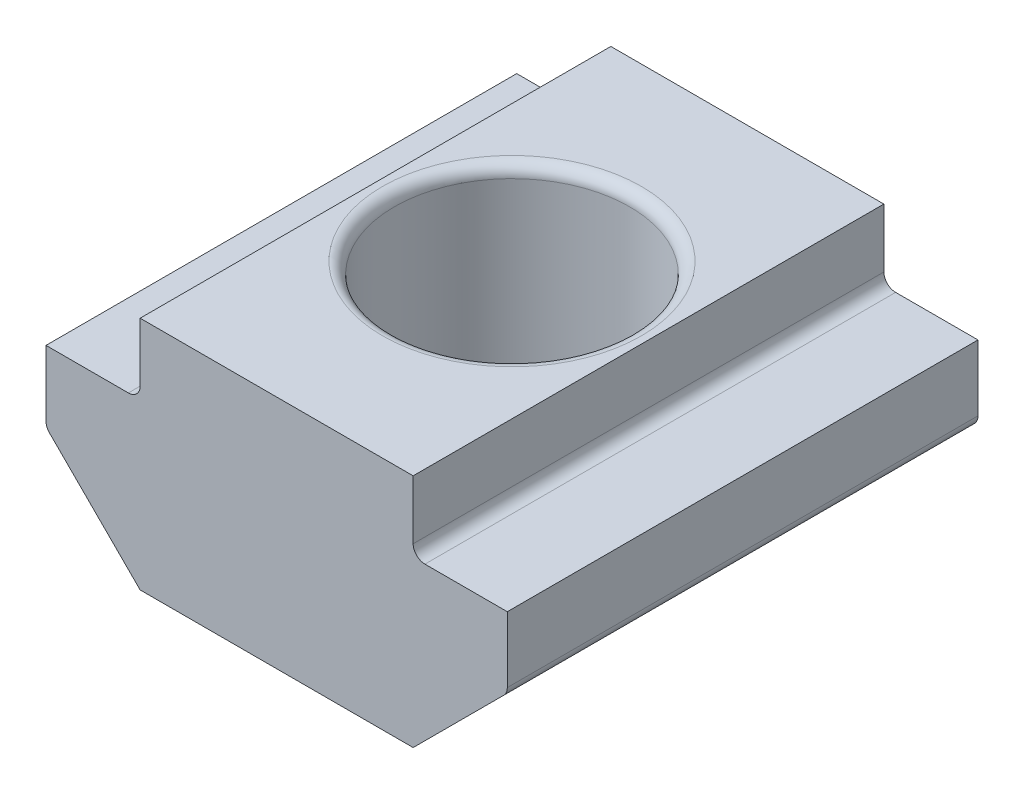
ISO-10303-21;
HEADER;
FILE_DESCRIPTION(('STEP AP214'),'2;1');
FILE_NAME('part.step','',(''),(''),'','','');
FILE_SCHEMA(('AUTOMOTIVE_DESIGN { 1 0 10303 214 1 1 1 1 }'));
ENDSEC;
DATA;
#1=APPLICATION_CONTEXT('core data for automotive mechanical design processes');
#2=APPLICATION_PROTOCOL_DEFINITION('international standard','automotive_design',2000,#1);
#3=PRODUCT_CONTEXT('',#1,'mechanical');
#4=PRODUCT('Part','Part','',(#3));
#5=PRODUCT_RELATED_PRODUCT_CATEGORY('part','',(#4));
#6=PRODUCT_DEFINITION_FORMATION('','',#4);
#7=PRODUCT_DEFINITION_CONTEXT('part definition',#1,'design');
#8=PRODUCT_DEFINITION('design','',#6,#7);
#9=PRODUCT_DEFINITION_SHAPE('','',#8);
#10=(LENGTH_UNIT() NAMED_UNIT(*) SI_UNIT(.MILLI.,.METRE.));
#11=(NAMED_UNIT(*) PLANE_ANGLE_UNIT() SI_UNIT($,.RADIAN.));
#12=(NAMED_UNIT(*) SI_UNIT($,.STERADIAN.) SOLID_ANGLE_UNIT());
#13=UNCERTAINTY_MEASURE_WITH_UNIT(LENGTH_MEASURE(1.E-05),#10,'distance_accuracy_value','');
#14=(GEOMETRIC_REPRESENTATION_CONTEXT(3) GLOBAL_UNCERTAINTY_ASSIGNED_CONTEXT((#13)) GLOBAL_UNIT_ASSIGNED_CONTEXT((#10,
#11,#12)) REPRESENTATION_CONTEXT('',''));
#15=CARTESIAN_POINT('',(0.,0.,0.));
#16=DIRECTION('',(0.,0.,1.));
#17=DIRECTION('',(1.,0.,0.));
#18=AXIS2_PLACEMENT_3D('',#15,#16,#17);
#19=CARTESIAN_POINT('',(2.9,-0.75,5.));
#20=DIRECTION('',(-1.,0.,0.));
#21=DIRECTION('',(0.,-1.,0.));
#22=AXIS2_PLACEMENT_3D('',#19,#20,#21);
#23=PLANE('',#22);
#24=DIRECTION('',(0.,1.,0.));
#25=VECTOR('',#24,1.);
#26=CARTESIAN_POINT('',(2.9,-0.75,5.));
#27=LINE('',#26,#25);
#28=CARTESIAN_POINT('',(2.9,-0.5,5.));
#29=VERTEX_POINT('',#28);
#30=CARTESIAN_POINT('',(2.9,0.75,5.));
#31=VERTEX_POINT('',#30);
#32=EDGE_CURVE('E138',#29,#31,#27,.T.);
#33=ORIENTED_EDGE('',*,*,#32,.F.);
#34=DIRECTION('',(0.,0.,-1.));
#35=VECTOR('',#34,1.);
#36=CARTESIAN_POINT('',(2.9,-0.5,-5.));
#37=LINE('',#36,#35);
#38=CARTESIAN_POINT('',(2.9,-0.5,-5.));
#39=VERTEX_POINT('',#38);
#40=EDGE_CURVE('E192',#29,#39,#37,.T.);
#41=ORIENTED_EDGE('',*,*,#40,.T.);
#42=DIRECTION('',(0.,1.,0.));
#43=VECTOR('',#42,1.);
#44=CARTESIAN_POINT('',(2.9,-0.75,-5.));
#45=LINE('',#44,#43);
#46=CARTESIAN_POINT('',(2.9,0.75,-5.));
#47=VERTEX_POINT('',#46);
#48=EDGE_CURVE('E163',#39,#47,#45,.T.);
#49=ORIENTED_EDGE('',*,*,#48,.T.);
#50=DIRECTION('',(0.,0.,-1.));
#51=VECTOR('',#50,1.);
#52=CARTESIAN_POINT('',(2.9,0.75,5.));
#53=LINE('',#52,#51);
#54=EDGE_CURVE('E156',#31,#47,#53,.T.);
#55=ORIENTED_EDGE('',*,*,#54,.F.);
#56=EDGE_LOOP('',(#33,#41,#49,#55));
#57=FACE_BOUND('',#56,.T.);
#58=ADVANCED_FACE('F36',(#57),#23,.F.);
#59=CARTESIAN_POINT('',(-2.9,0.75,5.));
#60=DIRECTION('',(0.,-1.,0.));
#61=DIRECTION('',(1.,0.,0.));
#62=AXIS2_PLACEMENT_3D('',#59,#60,#61);
#63=PLANE('',#62);
#64=CARTESIAN_POINT('',(0.,0.75,0.));
#65=DIRECTION('',(0.,-1.,0.));
#66=DIRECTION('',(1.,0.,0.));
#67=AXIS2_PLACEMENT_3D('',#64,#65,#66);
#68=CIRCLE('',#67,2.75);
#69=CARTESIAN_POINT('',(2.75,0.75,0.));
#70=VERTEX_POINT('',#69);
#71=EDGE_CURVE('E11',#70,#70,#68,.T.);
#72=ORIENTED_EDGE('',*,*,#71,.T.);
#73=EDGE_LOOP('',(#72));
#74=FACE_BOUND('',#73,.T.);
#75=DIRECTION('',(-1.,0.,0.));
#76=VECTOR('',#75,1.);
#77=CARTESIAN_POINT('',(-2.9,0.75,-5.));
#78=LINE('',#77,#76);
#79=CARTESIAN_POINT('',(-2.9,0.75,-5.));
#80=VERTEX_POINT('',#79);
#81=EDGE_CURVE('E278',#47,#80,#78,.T.);
#82=ORIENTED_EDGE('',*,*,#81,.T.);
#83=DIRECTION('',(0.,0.,-1.));
#84=VECTOR('',#83,1.);
#85=CARTESIAN_POINT('',(-2.9,0.75,5.));
#86=LINE('',#85,#84);
#87=CARTESIAN_POINT('',(-2.9,0.75,5.));
#88=VERTEX_POINT('',#87);
#89=EDGE_CURVE('E158',#88,#80,#86,.T.);
#90=ORIENTED_EDGE('',*,*,#89,.F.);
#91=DIRECTION('',(-1.,0.,0.));
#92=VECTOR('',#91,1.);
#93=CARTESIAN_POINT('',(-2.9,0.75,5.));
#94=LINE('',#93,#92);
#95=EDGE_CURVE('E143',#31,#88,#94,.T.);
#96=ORIENTED_EDGE('',*,*,#95,.F.);
#97=ORIENTED_EDGE('',*,*,#54,.T.);
#98=EDGE_LOOP('',(#82,#90,#96,#97));
#99=FACE_BOUND('',#98,.T.);
#100=ADVANCED_FACE('F155',(#74,#99),#63,.F.);
#101=CARTESIAN_POINT('',(-2.9,-0.750000000000001,5.));
#102=DIRECTION('',(1.,0.,0.));
#103=DIRECTION('',(0.,0.,-1.));
#104=AXIS2_PLACEMENT_3D('',#101,#102,#103);
#105=PLANE('',#104);
#106=DIRECTION('',(0.,-1.,0.));
#107=VECTOR('',#106,1.);
#108=CARTESIAN_POINT('',(-2.9,-0.750000000000001,-5.));
#109=LINE('',#108,#107);
#110=CARTESIAN_POINT('',(-2.9,-0.500000000000001,-5.));
#111=VERTEX_POINT('',#110);
#112=EDGE_CURVE('E273',#80,#111,#109,.T.);
#113=ORIENTED_EDGE('',*,*,#112,.T.);
#114=DIRECTION('',(0.,0.,-1.));
#115=VECTOR('',#114,1.);
#116=CARTESIAN_POINT('',(-2.9,-0.500000000000001,5.));
#117=LINE('',#116,#115);
#118=CARTESIAN_POINT('',(-2.9,-0.500000000000001,5.));
#119=VERTEX_POINT('',#118);
#120=EDGE_CURVE('E190',#111,#119,#117,.F.);
#121=ORIENTED_EDGE('',*,*,#120,.T.);
#122=DIRECTION('',(0.,-1.,0.));
#123=VECTOR('',#122,1.);
#124=CARTESIAN_POINT('',(-2.9,-0.750000000000001,5.));
#125=LINE('',#124,#123);
#126=EDGE_CURVE('E160',#88,#119,#125,.T.);
#127=ORIENTED_EDGE('',*,*,#126,.F.);
#128=ORIENTED_EDGE('',*,*,#89,.T.);
#129=EDGE_LOOP('',(#113,#121,#127,#128));
#130=FACE_BOUND('',#129,.T.);
#131=ADVANCED_FACE('F315',(#130),#105,.F.);
#132=CARTESIAN_POINT('',(-2.9,-0.750000000000001,5.));
#133=DIRECTION('',(0.,-1.,0.));
#134=DIRECTION('',(1.,0.,0.));
#135=AXIS2_PLACEMENT_3D('',#132,#133,#134);
#136=PLANE('',#135);
#137=DIRECTION('',(-1.,0.,0.));
#138=VECTOR('',#137,1.);
#139=CARTESIAN_POINT('',(-2.9,-0.750000000000001,5.));
#140=LINE('',#139,#138);
#141=CARTESIAN_POINT('',(-3.15,-0.750000000000001,5.));
#142=VERTEX_POINT('',#141);
#143=CARTESIAN_POINT('',(-4.9,-0.750000000000001,5.));
#144=VERTEX_POINT('',#143);
#145=EDGE_CURVE('E290',#142,#144,#140,.T.);
#146=ORIENTED_EDGE('',*,*,#145,.F.);
#147=DIRECTION('',(0.,0.,-1.));
#148=VECTOR('',#147,1.);
#149=CARTESIAN_POINT('',(-3.15,-0.750000000000001,-5.));
#150=LINE('',#149,#148);
#151=CARTESIAN_POINT('',(-3.15,-0.750000000000001,-5.));
#152=VERTEX_POINT('',#151);
#153=EDGE_CURVE('E187',#142,#152,#150,.T.);
#154=ORIENTED_EDGE('',*,*,#153,.T.);
#155=DIRECTION('',(-1.,0.,0.));
#156=VECTOR('',#155,1.);
#157=CARTESIAN_POINT('',(-2.9,-0.750000000000001,-5.));
#158=LINE('',#157,#156);
#159=CARTESIAN_POINT('',(-4.9,-0.750000000000001,-5.));
#160=VERTEX_POINT('',#159);
#161=EDGE_CURVE('E271',#152,#160,#158,.T.);
#162=ORIENTED_EDGE('',*,*,#161,.T.);
#163=DIRECTION('',(0.,0.,-1.));
#164=VECTOR('',#163,1.);
#165=CARTESIAN_POINT('',(-4.9,-0.750000000000001,5.));
#166=LINE('',#165,#164);
#167=EDGE_CURVE('E170',#144,#160,#166,.T.);
#168=ORIENTED_EDGE('',*,*,#167,.F.);
#169=EDGE_LOOP('',(#146,#154,#162,#168));
#170=FACE_BOUND('',#169,.T.);
#171=ADVANCED_FACE('F298',(#170),#136,.F.);
#172=CARTESIAN_POINT('',(-4.9,-0.750000000000001,5.));
#173=DIRECTION('',(1.,0.,0.));
#174=DIRECTION('',(0.,0.,-1.));
#175=AXIS2_PLACEMENT_3D('',#172,#173,#174);
#176=PLANE('',#175);
#177=DIRECTION('',(0.,-1.,0.));
#178=VECTOR('',#177,1.);
#179=CARTESIAN_POINT('',(-4.9,-0.750000000000001,-5.));
#180=LINE('',#179,#178);
#181=CARTESIAN_POINT('',(-4.9,-2.14644660940673,-5.));
#182=VERTEX_POINT('',#181);
#183=EDGE_CURVE('E265',#160,#182,#180,.T.);
#184=ORIENTED_EDGE('',*,*,#183,.T.);
#185=DIRECTION('',(0.,0.,-1.));
#186=VECTOR('',#185,1.);
#187=CARTESIAN_POINT('',(-4.9,-2.14644660940673,5.));
#188=LINE('',#187,#186);
#189=CARTESIAN_POINT('',(-4.9,-2.14644660940673,5.));
#190=VERTEX_POINT('',#189);
#191=EDGE_CURVE('E185',#182,#190,#188,.F.);
#192=ORIENTED_EDGE('',*,*,#191,.T.);
#193=DIRECTION('',(0.,-1.,0.));
#194=VECTOR('',#193,1.);
#195=CARTESIAN_POINT('',(-4.9,-0.750000000000001,5.));
#196=LINE('',#195,#194);
#197=EDGE_CURVE('E267',#144,#190,#196,.T.);
#198=ORIENTED_EDGE('',*,*,#197,.F.);
#199=ORIENTED_EDGE('',*,*,#167,.T.);
#200=EDGE_LOOP('',(#184,#192,#198,#199));
#201=FACE_BOUND('',#200,.T.);
#202=ADVANCED_FACE('F264',(#201),#176,.F.);
#203=CARTESIAN_POINT('',(-4.9,-2.25,5.));
#204=DIRECTION('',(0.707106781186545,0.70710678118655,0.));
#205=DIRECTION('',(-0.70710678118655,0.707106781186545,0.));
#206=AXIS2_PLACEMENT_3D('',#203,#204,#205);
#207=PLANE('',#206);
#208=DIRECTION('',(0.70710678118655,-0.707106781186545,0.));
#209=VECTOR('',#208,1.);
#210=CARTESIAN_POINT('',(-4.9,-2.25,5.));
#211=LINE('',#210,#209);
#212=CARTESIAN_POINT('',(-4.82677669529664,-2.32322330470336,5.));
#213=VERTEX_POINT('',#212);
#214=CARTESIAN_POINT('',(-2.89999999999999,-4.25,5.));
#215=VERTEX_POINT('',#214);
#216=EDGE_CURVE('E287',#213,#215,#211,.T.);
#217=ORIENTED_EDGE('',*,*,#216,.F.);
#218=DIRECTION('',(0.,0.,-1.));
#219=VECTOR('',#218,1.);
#220=CARTESIAN_POINT('',(-4.82677669529664,-2.32322330470336,5.));
#221=LINE('',#220,#219);
#222=CARTESIAN_POINT('',(-4.82677669529664,-2.32322330470336,-5.));
#223=VERTEX_POINT('',#222);
#224=EDGE_CURVE('E182',#213,#223,#221,.T.);
#225=ORIENTED_EDGE('',*,*,#224,.T.);
#226=DIRECTION('',(0.70710678118655,-0.707106781186545,0.));
#227=VECTOR('',#226,1.);
#228=CARTESIAN_POINT('',(-4.9,-2.25,-5.));
#229=LINE('',#228,#227);
#230=CARTESIAN_POINT('',(-2.89999999999999,-4.25,-5.));
#231=VERTEX_POINT('',#230);
#232=EDGE_CURVE('E239',#223,#231,#229,.T.);
#233=ORIENTED_EDGE('',*,*,#232,.T.);
#234=DIRECTION('',(0.,0.,-1.));
#235=VECTOR('',#234,1.);
#236=CARTESIAN_POINT('',(-2.89999999999999,-4.25,5.));
#237=LINE('',#236,#235);
#238=EDGE_CURVE('E234',#215,#231,#237,.T.);
#239=ORIENTED_EDGE('',*,*,#238,.F.);
#240=EDGE_LOOP('',(#217,#225,#233,#239));
#241=FACE_BOUND('',#240,.T.);
#242=ADVANCED_FACE('F223',(#241),#207,.F.);
#243=CARTESIAN_POINT('',(-2.89999999999999,-4.25,5.));
#244=DIRECTION('',(0.,1.,0.));
#245=DIRECTION('',(-1.,0.,0.));
#246=AXIS2_PLACEMENT_3D('',#243,#244,#245);
#247=PLANE('',#246);
#248=CARTESIAN_POINT('',(0.,-4.25,0.));
#249=DIRECTION('',(0.,1.,0.));
#250=DIRECTION('',(-1.,0.,0.));
#251=AXIS2_PLACEMENT_3D('',#248,#249,#250);
#252=CIRCLE('',#251,2.75);
#253=CARTESIAN_POINT('',(-2.75,-4.25,0.));
#254=VERTEX_POINT('',#253);
#255=EDGE_CURVE('E202',#254,#254,#252,.T.);
#256=ORIENTED_EDGE('',*,*,#255,.T.);
#257=EDGE_LOOP('',(#256));
#258=FACE_BOUND('',#257,.T.);
#259=DIRECTION('',(1.,0.,0.));
#260=VECTOR('',#259,1.);
#261=CARTESIAN_POINT('',(-2.89999999999999,-4.25,-5.));
#262=LINE('',#261,#260);
#263=CARTESIAN_POINT('',(2.89999999999999,-4.25,-5.));
#264=VERTEX_POINT('',#263);
#265=EDGE_CURVE('E228',#231,#264,#262,.T.);
#266=ORIENTED_EDGE('',*,*,#265,.T.);
#267=DIRECTION('',(0.,0.,-1.));
#268=VECTOR('',#267,1.);
#269=CARTESIAN_POINT('',(2.89999999999999,-4.25,5.));
#270=LINE('',#269,#268);
#271=CARTESIAN_POINT('',(2.89999999999999,-4.25,5.));
#272=VERTEX_POINT('',#271);
#273=EDGE_CURVE('E231',#272,#264,#270,.T.);
#274=ORIENTED_EDGE('',*,*,#273,.F.);
#275=DIRECTION('',(1.,0.,0.));
#276=VECTOR('',#275,1.);
#277=CARTESIAN_POINT('',(-2.89999999999999,-4.25,5.));
#278=LINE('',#277,#276);
#279=EDGE_CURVE('E285',#215,#272,#278,.T.);
#280=ORIENTED_EDGE('',*,*,#279,.F.);
#281=ORIENTED_EDGE('',*,*,#238,.T.);
#282=EDGE_LOOP('',(#266,#274,#280,#281));
#283=FACE_BOUND('',#282,.T.);
#284=ADVANCED_FACE('F219',(#258,#283),#247,.F.);
#285=CARTESIAN_POINT('',(4.9,-2.25,5.));
#286=DIRECTION('',(-0.707106781186545,0.70710678118655,0.));
#287=DIRECTION('',(-0.70710678118655,-0.707106781186545,0.));
#288=AXIS2_PLACEMENT_3D('',#285,#286,#287);
#289=PLANE('',#288);
#290=DIRECTION('',(0.70710678118655,0.707106781186545,0.));
#291=VECTOR('',#290,1.);
#292=CARTESIAN_POINT('',(4.9,-2.25,-5.));
#293=LINE('',#292,#291);
#294=CARTESIAN_POINT('',(4.82677669529664,-2.32322330470336,-5.));
#295=VERTEX_POINT('',#294);
#296=EDGE_CURVE('E238',#264,#295,#293,.T.);
#297=ORIENTED_EDGE('',*,*,#296,.T.);
#298=DIRECTION('',(0.,0.,-1.));
#299=VECTOR('',#298,1.);
#300=CARTESIAN_POINT('',(4.82677669529664,-2.32322330470336,5.));
#301=LINE('',#300,#299);
#302=CARTESIAN_POINT('',(4.82677669529664,-2.32322330470336,5.));
#303=VERTEX_POINT('',#302);
#304=EDGE_CURVE('E177',#295,#303,#301,.F.);
#305=ORIENTED_EDGE('',*,*,#304,.T.);
#306=DIRECTION('',(0.70710678118655,0.707106781186545,0.));
#307=VECTOR('',#306,1.);
#308=CARTESIAN_POINT('',(4.9,-2.25,5.));
#309=LINE('',#308,#307);
#310=EDGE_CURVE('E244',#272,#303,#309,.T.);
#311=ORIENTED_EDGE('',*,*,#310,.F.);
#312=ORIENTED_EDGE('',*,*,#273,.T.);
#313=EDGE_LOOP('',(#297,#305,#311,#312));
#314=FACE_BOUND('',#313,.T.);
#315=ADVANCED_FACE('F222',(#314),#289,.F.);
#316=CARTESIAN_POINT('',(4.9,-0.75,5.));
#317=DIRECTION('',(-1.,0.,0.));
#318=DIRECTION('',(0.,-1.,0.));
#319=AXIS2_PLACEMENT_3D('',#316,#317,#318);
#320=PLANE('',#319);
#321=DIRECTION('',(0.,1.,0.));
#322=VECTOR('',#321,1.);
#323=CARTESIAN_POINT('',(4.9,-0.75,5.));
#324=LINE('',#323,#322);
#325=CARTESIAN_POINT('',(4.9,-2.14644660940673,5.));
#326=VERTEX_POINT('',#325);
#327=CARTESIAN_POINT('',(4.9,-0.75,5.));
#328=VERTEX_POINT('',#327);
#329=EDGE_CURVE('E282',#326,#328,#324,.T.);
#330=ORIENTED_EDGE('',*,*,#329,.F.);
#331=DIRECTION('',(0.,0.,-1.));
#332=VECTOR('',#331,1.);
#333=CARTESIAN_POINT('',(4.9,-2.14644660940673,5.));
#334=LINE('',#333,#332);
#335=CARTESIAN_POINT('',(4.9,-2.14644660940673,-5.));
#336=VERTEX_POINT('',#335);
#337=EDGE_CURVE('E165',#326,#336,#334,.T.);
#338=ORIENTED_EDGE('',*,*,#337,.T.);
#339=DIRECTION('',(0.,1.,0.));
#340=VECTOR('',#339,1.);
#341=CARTESIAN_POINT('',(4.9,-0.75,-5.));
#342=LINE('',#341,#340);
#343=CARTESIAN_POINT('',(4.9,-0.75,-5.));
#344=VERTEX_POINT('',#343);
#345=EDGE_CURVE('E249',#336,#344,#342,.T.);
#346=ORIENTED_EDGE('',*,*,#345,.T.);
#347=DIRECTION('',(0.,0.,-1.));
#348=VECTOR('',#347,1.);
#349=CARTESIAN_POINT('',(4.9,-0.75,5.));
#350=LINE('',#349,#348);
#351=EDGE_CURVE('E245',#328,#344,#350,.T.);
#352=ORIENTED_EDGE('',*,*,#351,.F.);
#353=EDGE_LOOP('',(#330,#338,#346,#352));
#354=FACE_BOUND('',#353,.T.);
#355=ADVANCED_FACE('F309',(#354),#320,.F.);
#356=CARTESIAN_POINT('',(2.9,-0.75,5.));
#357=DIRECTION('',(0.,-1.,0.));
#358=DIRECTION('',(1.,0.,0.));
#359=AXIS2_PLACEMENT_3D('',#356,#357,#358);
#360=PLANE('',#359);
#361=DIRECTION('',(-1.,0.,0.));
#362=VECTOR('',#361,1.);
#363=CARTESIAN_POINT('',(2.9,-0.75,-5.));
#364=LINE('',#363,#362);
#365=CARTESIAN_POINT('',(3.15,-0.75,-5.));
#366=VERTEX_POINT('',#365);
#367=EDGE_CURVE('E151',#344,#366,#364,.T.);
#368=ORIENTED_EDGE('',*,*,#367,.T.);
#369=DIRECTION('',(0.,0.,-1.));
#370=VECTOR('',#369,1.);
#371=CARTESIAN_POINT('',(3.15,-0.75,5.));
#372=LINE('',#371,#370);
#373=CARTESIAN_POINT('',(3.15,-0.75,5.));
#374=VERTEX_POINT('',#373);
#375=EDGE_CURVE('E51',#366,#374,#372,.F.);
#376=ORIENTED_EDGE('',*,*,#375,.T.);
#377=DIRECTION('',(-1.,0.,0.));
#378=VECTOR('',#377,1.);
#379=CARTESIAN_POINT('',(2.9,-0.75,5.));
#380=LINE('',#379,#378);
#381=EDGE_CURVE('E256',#328,#374,#380,.T.);
#382=ORIENTED_EDGE('',*,*,#381,.F.);
#383=ORIENTED_EDGE('',*,*,#351,.T.);
#384=EDGE_LOOP('',(#368,#376,#382,#383));
#385=FACE_BOUND('',#384,.T.);
#386=ADVANCED_FACE('F312',(#385),#360,.F.);
#387=CARTESIAN_POINT('',(0.,0.,5.));
#388=DIRECTION('',(0.,0.,-1.));
#389=DIRECTION('',(-1.,0.,0.));
#390=AXIS2_PLACEMENT_3D('',#387,#388,#389);
#391=PLANE('',#390);
#392=ORIENTED_EDGE('',*,*,#310,.T.);
#393=CARTESIAN_POINT('',(4.65,-2.14644660940673,5.));
#394=DIRECTION('',(0.,0.,-1.));
#395=DIRECTION('',(-1.,0.,0.));
#396=AXIS2_PLACEMENT_3D('',#393,#394,#395);
#397=CIRCLE('',#396,0.25);
#398=EDGE_CURVE('E180',#303,#326,#397,.F.);
#399=ORIENTED_EDGE('',*,*,#398,.T.);
#400=ORIENTED_EDGE('',*,*,#329,.T.);
#401=ORIENTED_EDGE('',*,*,#381,.T.);
#402=CARTESIAN_POINT('',(3.15,-0.5,5.));
#403=DIRECTION('',(0.,0.,-1.));
#404=DIRECTION('',(-1.,0.,0.));
#405=AXIS2_PLACEMENT_3D('',#402,#403,#404);
#406=CIRCLE('',#405,0.25);
#407=EDGE_CURVE('E146',#374,#29,#406,.T.);
#408=ORIENTED_EDGE('',*,*,#407,.T.);
#409=ORIENTED_EDGE('',*,*,#32,.T.);
#410=ORIENTED_EDGE('',*,*,#95,.T.);
#411=ORIENTED_EDGE('',*,*,#126,.T.);
#412=CARTESIAN_POINT('',(-3.15,-0.500000000000001,5.));
#413=DIRECTION('',(0.,0.,-1.));
#414=DIRECTION('',(-1.,0.,0.));
#415=AXIS2_PLACEMENT_3D('',#412,#413,#414);
#416=CIRCLE('',#415,0.25);
#417=EDGE_CURVE('E197',#119,#142,#416,.T.);
#418=ORIENTED_EDGE('',*,*,#417,.T.);
#419=ORIENTED_EDGE('',*,*,#145,.T.);
#420=ORIENTED_EDGE('',*,*,#197,.T.);
#421=CARTESIAN_POINT('',(-4.65,-2.14644660940673,5.));
#422=DIRECTION('',(0.,0.,-1.));
#423=DIRECTION('',(-1.,0.,0.));
#424=AXIS2_PLACEMENT_3D('',#421,#422,#423);
#425=CIRCLE('',#424,0.25);
#426=EDGE_CURVE('E59',#190,#213,#425,.F.);
#427=ORIENTED_EDGE('',*,*,#426,.T.);
#428=ORIENTED_EDGE('',*,*,#216,.T.);
#429=ORIENTED_EDGE('',*,*,#279,.T.);
#430=EDGE_LOOP('',(#392,#399,#400,#401,#408,#409,#410,#411,#418,#419,#420,#427,#428,#429));
#431=FACE_BOUND('',#430,.T.);
#432=ADVANCED_FACE('F141',(#431),#391,.F.);
#433=CARTESIAN_POINT('',(0.,0.,-5.));
#434=DIRECTION('',(0.,0.,-1.));
#435=DIRECTION('',(-1.,0.,0.));
#436=AXIS2_PLACEMENT_3D('',#433,#434,#435);
#437=PLANE('',#436);
#438=ORIENTED_EDGE('',*,*,#345,.F.);
#439=CARTESIAN_POINT('',(4.65,-2.14644660940673,-5.));
#440=DIRECTION('',(0.,0.,-1.));
#441=DIRECTION('',(-1.,0.,0.));
#442=AXIS2_PLACEMENT_3D('',#439,#440,#441);
#443=CIRCLE('',#442,0.25);
#444=EDGE_CURVE('E175',#336,#295,#443,.T.);
#445=ORIENTED_EDGE('',*,*,#444,.T.);
#446=ORIENTED_EDGE('',*,*,#296,.F.);
#447=ORIENTED_EDGE('',*,*,#265,.F.);
#448=ORIENTED_EDGE('',*,*,#232,.F.);
#449=CARTESIAN_POINT('',(-4.65,-2.14644660940673,-5.));
#450=DIRECTION('',(0.,0.,-1.));
#451=DIRECTION('',(-1.,0.,0.));
#452=AXIS2_PLACEMENT_3D('',#449,#450,#451);
#453=CIRCLE('',#452,0.25);
#454=EDGE_CURVE('E168',#223,#182,#453,.T.);
#455=ORIENTED_EDGE('',*,*,#454,.T.);
#456=ORIENTED_EDGE('',*,*,#183,.F.);
#457=ORIENTED_EDGE('',*,*,#161,.F.);
#458=CARTESIAN_POINT('',(-3.15,-0.500000000000001,-5.));
#459=DIRECTION('',(0.,0.,-1.));
#460=DIRECTION('',(-1.,0.,0.));
#461=AXIS2_PLACEMENT_3D('',#458,#459,#460);
#462=CIRCLE('',#461,0.25);
#463=EDGE_CURVE('E195',#152,#111,#462,.F.);
#464=ORIENTED_EDGE('',*,*,#463,.T.);
#465=ORIENTED_EDGE('',*,*,#112,.F.);
#466=ORIENTED_EDGE('',*,*,#81,.F.);
#467=ORIENTED_EDGE('',*,*,#48,.F.);
#468=CARTESIAN_POINT('',(3.15,-0.5,-5.));
#469=DIRECTION('',(0.,0.,-1.));
#470=DIRECTION('',(-1.,0.,0.));
#471=AXIS2_PLACEMENT_3D('',#468,#469,#470);
#472=CIRCLE('',#471,0.25);
#473=EDGE_CURVE('E199',#39,#366,#472,.F.);
#474=ORIENTED_EDGE('',*,*,#473,.T.);
#475=ORIENTED_EDGE('',*,*,#367,.F.);
#476=EDGE_LOOP('',(#438,#445,#446,#447,#448,#455,#456,#457,#464,#465,#466,#467,#474,#475));
#477=FACE_BOUND('',#476,.T.);
#478=ADVANCED_FACE('F248',(#477),#437,.T.);
#479=CARTESIAN_POINT('',(0.,-4.25,0.));
#480=DIRECTION('',(0.,1.,0.));
#481=DIRECTION('',(0.,0.,1.));
#482=AXIS2_PLACEMENT_3D('',#479,#480,#481);
#483=CYLINDRICAL_SURFACE('',#482,2.5);
#484=CARTESIAN_POINT('',(0.,-4.,0.));
#485=DIRECTION('',(0.,1.,0.));
#486=DIRECTION('',(-1.,0.,0.));
#487=AXIS2_PLACEMENT_3D('',#484,#485,#486);
#488=CIRCLE('',#487,2.5);
#489=CARTESIAN_POINT('',(-2.5,-4.,0.));
#490=VERTEX_POINT('',#489);
#491=EDGE_CURVE('E44',#490,#490,#488,.F.);
#492=ORIENTED_EDGE('',*,*,#491,.T.);
#493=EDGE_LOOP('',(#492));
#494=FACE_BOUND('',#493,.T.);
#495=CARTESIAN_POINT('',(0.,0.5,0.));
#496=DIRECTION('',(0.,-1.,0.));
#497=DIRECTION('',(1.,0.,0.));
#498=AXIS2_PLACEMENT_3D('',#495,#496,#497);
#499=CIRCLE('',#498,2.5);
#500=CARTESIAN_POINT('',(2.5,0.5,0.));
#501=VERTEX_POINT('',#500);
#502=EDGE_CURVE('E205',#501,#501,#499,.F.);
#503=ORIENTED_EDGE('',*,*,#502,.T.);
#504=EDGE_LOOP('',(#503));
#505=FACE_BOUND('',#504,.T.);
#506=ADVANCED_FACE('F210',(#494,#505),#483,.F.);
#507=CARTESIAN_POINT('',(4.65,-2.14644660940673,5.));
#508=DIRECTION('',(0.,0.,-1.));
#509=DIRECTION('',(-1.,0.,0.));
#510=AXIS2_PLACEMENT_3D('',#507,#508,#509);
#511=CYLINDRICAL_SURFACE('',#510,0.25);
#512=ORIENTED_EDGE('',*,*,#398,.F.);
#513=ORIENTED_EDGE('',*,*,#304,.F.);
#514=ORIENTED_EDGE('',*,*,#444,.F.);
#515=ORIENTED_EDGE('',*,*,#337,.F.);
#516=EDGE_LOOP('',(#512,#513,#514,#515));
#517=FACE_BOUND('',#516,.T.);
#518=ADVANCED_FACE('F307',(#517),#511,.T.);
#519=CARTESIAN_POINT('',(-4.65,-2.14644660940673,5.));
#520=DIRECTION('',(0.,0.,-1.));
#521=DIRECTION('',(-1.,0.,0.));
#522=AXIS2_PLACEMENT_3D('',#519,#520,#521);
#523=CYLINDRICAL_SURFACE('',#522,0.25);
#524=ORIENTED_EDGE('',*,*,#426,.F.);
#525=ORIENTED_EDGE('',*,*,#191,.F.);
#526=ORIENTED_EDGE('',*,*,#454,.F.);
#527=ORIENTED_EDGE('',*,*,#224,.F.);
#528=EDGE_LOOP('',(#524,#525,#526,#527));
#529=FACE_BOUND('',#528,.T.);
#530=ADVANCED_FACE('F301',(#529),#523,.T.);
#531=CARTESIAN_POINT('',(-3.15,-0.500000000000001,5.));
#532=DIRECTION('',(0.,0.,1.));
#533=DIRECTION('',(1.,0.,0.));
#534=AXIS2_PLACEMENT_3D('',#531,#532,#533);
#535=CYLINDRICAL_SURFACE('',#534,0.25);
#536=ORIENTED_EDGE('',*,*,#417,.F.);
#537=ORIENTED_EDGE('',*,*,#120,.F.);
#538=ORIENTED_EDGE('',*,*,#463,.F.);
#539=ORIENTED_EDGE('',*,*,#153,.F.);
#540=EDGE_LOOP('',(#536,#537,#538,#539));
#541=FACE_BOUND('',#540,.T.);
#542=ADVANCED_FACE('F297',(#541),#535,.F.);
#543=CARTESIAN_POINT('',(3.15,-0.5,5.));
#544=DIRECTION('',(0.,0.,1.));
#545=DIRECTION('',(1.,0.,0.));
#546=AXIS2_PLACEMENT_3D('',#543,#544,#545);
#547=CYLINDRICAL_SURFACE('',#546,0.25);
#548=ORIENTED_EDGE('',*,*,#407,.F.);
#549=ORIENTED_EDGE('',*,*,#375,.F.);
#550=ORIENTED_EDGE('',*,*,#473,.F.);
#551=ORIENTED_EDGE('',*,*,#40,.F.);
#552=EDGE_LOOP('',(#548,#549,#550,#551));
#553=FACE_BOUND('',#552,.T.);
#554=ADVANCED_FACE('F216',(#553),#547,.F.);
#555=CARTESIAN_POINT('',(0.,-4.,0.));
#556=DIRECTION('',(0.,1.,0.));
#557=DIRECTION('',(-1.,0.,0.));
#558=AXIS2_PLACEMENT_3D('',#555,#556,#557);
#559=TOROIDAL_SURFACE('',#558,2.75,0.25);
#560=ORIENTED_EDGE('',*,*,#491,.F.);
#561=EDGE_LOOP('',(#560));
#562=FACE_BOUND('',#561,.T.);
#563=ORIENTED_EDGE('',*,*,#255,.F.);
#564=EDGE_LOOP('',(#563));
#565=FACE_BOUND('',#564,.T.);
#566=ADVANCED_FACE('F213',(#562,#565),#559,.T.);
#567=CARTESIAN_POINT('',(0.,0.5,0.));
#568=DIRECTION('',(0.,-1.,0.));
#569=DIRECTION('',(1.,0.,0.));
#570=AXIS2_PLACEMENT_3D('',#567,#568,#569);
#571=TOROIDAL_SURFACE('',#570,2.75,0.25);
#572=ORIENTED_EDGE('',*,*,#71,.F.);
#573=EDGE_LOOP('',(#572));
#574=FACE_BOUND('',#573,.T.);
#575=ORIENTED_EDGE('',*,*,#502,.F.);
#576=EDGE_LOOP('',(#575));
#577=FACE_BOUND('',#576,.T.);
#578=ADVANCED_FACE('F38',(#574,#577),#571,.T.);
#579=CLOSED_SHELL('',(#58,#100,#131,#171,#202,#242,#284,#315,#355,#386,#432,#478,#506,#518,#530,
#542,#554,#566,#578));
#580=MANIFOLD_SOLID_BREP('B2',#579);
#581=ADVANCED_BREP_SHAPE_REPRESENTATION('',(#18,#580),#14);
#582=SHAPE_DEFINITION_REPRESENTATION(#9,#581);
ENDSEC;
END-ISO-10303-21;
